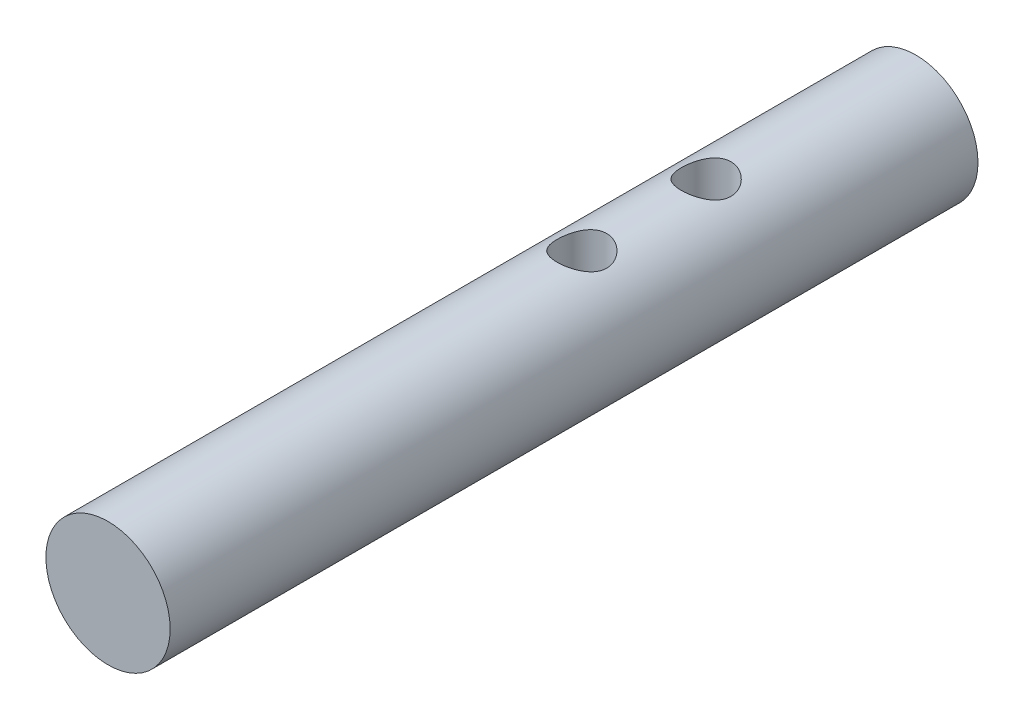
ISO-10303-21;
HEADER;
FILE_DESCRIPTION(('STEP AP214'),'2;1');
FILE_NAME('part.step','',(''),(''),'','','');
FILE_SCHEMA(('AUTOMOTIVE_DESIGN { 1 0 10303 214 1 1 1 1 }'));
ENDSEC;
DATA;
#1=APPLICATION_CONTEXT('core data for automotive mechanical design processes');
#2=APPLICATION_PROTOCOL_DEFINITION('international standard','automotive_design',2000,#1);
#3=PRODUCT_CONTEXT('',#1,'mechanical');
#4=PRODUCT('Part','Part','',(#3));
#5=PRODUCT_RELATED_PRODUCT_CATEGORY('part','',(#4));
#6=PRODUCT_DEFINITION_FORMATION('','',#4);
#7=PRODUCT_DEFINITION_CONTEXT('part definition',#1,'design');
#8=PRODUCT_DEFINITION('design','',#6,#7);
#9=PRODUCT_DEFINITION_SHAPE('','',#8);
#10=(LENGTH_UNIT() NAMED_UNIT(*) SI_UNIT(.MILLI.,.METRE.));
#11=(NAMED_UNIT(*) PLANE_ANGLE_UNIT() SI_UNIT($,.RADIAN.));
#12=(NAMED_UNIT(*) SI_UNIT($,.STERADIAN.) SOLID_ANGLE_UNIT());
#13=UNCERTAINTY_MEASURE_WITH_UNIT(LENGTH_MEASURE(1.E-05),#10,'distance_accuracy_value','');
#14=(GEOMETRIC_REPRESENTATION_CONTEXT(3) GLOBAL_UNCERTAINTY_ASSIGNED_CONTEXT((#13)) GLOBAL_UNIT_ASSIGNED_CONTEXT((#10,
#11,#12)) REPRESENTATION_CONTEXT('',''));
#15=CARTESIAN_POINT('',(0.,0.,0.));
#16=DIRECTION('',(0.,0.,1.));
#17=DIRECTION('',(1.,0.,0.));
#18=AXIS2_PLACEMENT_3D('',#15,#16,#17);
#19=CARTESIAN_POINT('',(0.,0.,52.));
#20=DIRECTION('',(0.,0.,-1.));
#21=DIRECTION('',(-1.,0.,0.));
#22=AXIS2_PLACEMENT_3D('',#19,#20,#21);
#23=CYLINDRICAL_SURFACE('',#22,4.);
#24=CARTESIAN_POINT('',(0.,-4.,15.1));
#25=CARTESIAN_POINT('',(0.085994404354313,-3.99999416981668,15.099992118541));
#26=CARTESIAN_POINT('',(0.172138051272538,-3.99719435445546,15.0930257983293));
#27=CARTESIAN_POINT('',(0.341997184334316,-3.98626762480513,15.065401837183));
#28=CARTESIAN_POINT('',(0.425705422048998,-3.97812622959102,15.0447069767311));
#29=CARTESIAN_POINT('',(0.587963138181922,-3.95739367370495,14.9904991375529));
#30=CARTESIAN_POINT('',(0.666528529293566,-3.94481709091258,14.9570281230266));
#31=CARTESIAN_POINT('',(0.816857576262693,-3.91645288636863,14.8783846613388));
#32=CARTESIAN_POINT('',(0.888623581400793,-3.90066637966445,14.8332162760649));
#33=CARTESIAN_POINT('',(1.02680080605631,-3.86664708936335,14.7302116011513));
#34=CARTESIAN_POINT('',(1.09284981804017,-3.84833837543352,14.6719146750078));
#35=CARTESIAN_POINT('',(1.21454000382778,-3.81168461524956,14.5452799972186));
#36=CARTESIAN_POINT('',(1.27017608570683,-3.79333955563034,14.4769373622306));
#37=CARTESIAN_POINT('',(1.3718996538343,-3.75778233437709,14.3284575438062));
#38=CARTESIAN_POINT('',(1.41745198495638,-3.74065692771961,14.2479308111814));
#39=CARTESIAN_POINT('',(1.49420377522972,-3.71066917749434,14.079570881264));
#40=CARTESIAN_POINT('',(1.52541005142867,-3.69780480995341,13.9917411777213));
#41=CARTESIAN_POINT('',(1.57111905871669,-3.67861086128655,13.8154301331263));
#42=CARTESIAN_POINT('',(1.58631517264452,-3.67201136284484,13.727159011539));
#43=CARTESIAN_POINT('',(1.60173836931202,-3.66531203239315,13.5490920013542));
#44=CARTESIAN_POINT('',(1.60197281305058,-3.66520900418215,13.4592968843));
#45=CARTESIAN_POINT('',(1.58799149400364,-3.67128400223995,13.2873946628336));
#46=CARTESIAN_POINT('',(1.57478025144411,-3.6770254003076,13.2051874284728));
#47=CARTESIAN_POINT('',(1.53595750423826,-3.69340950086269,13.0442723551946));
#48=CARTESIAN_POINT('',(1.51034383584371,-3.70405305857338,12.9655651295118));
#49=CARTESIAN_POINT('',(1.44695578604086,-3.72927588070824,12.8119857310432));
#50=CARTESIAN_POINT('',(1.40894388985225,-3.7439310342463,12.7372246087562));
#51=CARTESIAN_POINT('',(1.32200516858577,-3.77550493111912,12.5948673469107));
#52=CARTESIAN_POINT('',(1.27307424408067,-3.79242452365479,12.5272739124778));
#53=CARTESIAN_POINT('',(1.16124047956355,-3.82821389393817,12.3956722169584));
#54=CARTESIAN_POINT('',(1.09754997037651,-3.84713331980921,12.3323450164432));
#55=CARTESIAN_POINT('',(0.960251541944155,-3.88367859966626,12.2170524175984));
#56=CARTESIAN_POINT('',(0.886641652267547,-3.9013041955626,12.1650892820718));
#57=CARTESIAN_POINT('',(0.729662122084675,-3.93371745011639,12.0731060420673));
#58=CARTESIAN_POINT('',(0.646128393077184,-3.94844216076332,12.0333421750424));
#59=CARTESIAN_POINT('',(0.472819012386308,-3.97291862663007,11.9686657111376));
#60=CARTESIAN_POINT('',(0.383046557479741,-3.98267290769906,11.9437455699541));
#61=CARTESIAN_POINT('',(0.205516710086258,-3.99564911605528,11.9108413636642));
#62=CARTESIAN_POINT('',(0.11795463518843,-3.99922356666811,11.9019420365972));
#63=CARTESIAN_POINT('',(-0.0574762478462522,-4.00054782808505,11.8986295195771));
#64=CARTESIAN_POINT('',(-0.145344970579138,-3.99829914865833,11.904212574762));
#65=CARTESIAN_POINT('',(-0.314746191297589,-3.98846053651002,11.9290334020416));
#66=CARTESIAN_POINT('',(-0.396385993420379,-3.98111513076419,11.9476463842808));
#67=CARTESIAN_POINT('',(-0.555308342448623,-3.962075531244,11.9971485666478));
#68=CARTESIAN_POINT('',(-0.632590328179875,-3.95038077885224,12.0280393437349));
#69=CARTESIAN_POINT('',(-0.783263028653361,-3.92333275816649,12.102227951744));
#70=CARTESIAN_POINT('',(-0.856462418204324,-3.90787852783843,12.1458763776345));
#71=CARTESIAN_POINT('',(-0.994754872997244,-3.8749869179642,12.2439522591245));
#72=CARTESIAN_POINT('',(-1.0598446726089,-3.85754874488216,12.2983840343381));
#73=CARTESIAN_POINT('',(-1.18457843442306,-3.82116094110489,12.4206960103597));
#74=CARTESIAN_POINT('',(-1.24357914704485,-3.80218753140042,12.489226833205));
#75=CARTESIAN_POINT('',(-1.34940095793097,-3.76593338333706,12.6355520664075));
#76=CARTESIAN_POINT('',(-1.39622004907001,-3.74865292421209,12.713348000272));
#77=CARTESIAN_POINT('',(-1.4766460015453,-3.71771439926167,12.8771693556753));
#78=CARTESIAN_POINT('',(-1.51012047562756,-3.7040930470783,12.9632671993698));
#79=CARTESIAN_POINT('',(-1.56183697576424,-3.68258938782345,13.1405869213721));
#80=CARTESIAN_POINT('',(-1.58009024421545,-3.67470284556799,13.2318049646499));
#81=CARTESIAN_POINT('',(-1.59977249382272,-3.66617407439941,13.4097023214196));
#82=CARTESIAN_POINT('',(-1.60231766584229,-3.66505136806537,13.4962358716747));
#83=CARTESIAN_POINT('',(-1.59344252742202,-3.66891868826478,13.6684358861706));
#84=CARTESIAN_POINT('',(-1.58202399033103,-3.67390793859835,13.7541024591221));
#85=CARTESIAN_POINT('',(-1.54645709292292,-3.68901319263216,13.918665751884));
#86=CARTESIAN_POINT('',(-1.52282999485678,-3.69891865461959,13.9976962195464));
#87=CARTESIAN_POINT('',(-1.46400435879281,-3.72259200986157,14.1507029036908));
#88=CARTESIAN_POINT('',(-1.42880262511505,-3.73636096964805,14.2246777175199));
#89=CARTESIAN_POINT('',(-1.34549821020779,-3.76718887683593,14.3700876954166));
#90=CARTESIAN_POINT('',(-1.29677226812759,-3.78439105850594,14.4411349361044));
#91=CARTESIAN_POINT('',(-1.1887136954172,-3.8197104349779,14.574394653763));
#92=CARTESIAN_POINT('',(-1.1293778678545,-3.83782790438725,14.6366044577027));
#93=CARTESIAN_POINT('',(-0.997204405017971,-3.87434853669915,14.7545622826109));
#94=CARTESIAN_POINT('',(-0.923740800916912,-3.89269406369748,14.8096298455185));
#95=CARTESIAN_POINT('',(-0.767920256228625,-3.92640325370973,14.9066696340973));
#96=CARTESIAN_POINT('',(-0.685559203637791,-3.94176552874325,14.948635769722));
#97=CARTESIAN_POINT('',(-0.515790449996163,-3.96751771852689,15.0172977721522));
#98=CARTESIAN_POINT('',(-0.428505294575758,-3.97799490444022,15.0442634588483));
#99=CARTESIAN_POINT('',(-0.250301237024977,-3.99315444967493,15.0829112967634));
#100=CARTESIAN_POINT('',(-0.159394820687131,-3.9978551959651,15.0946419493951));
#101=CARTESIAN_POINT('',(-0.0455298383127442,-3.99980719603309,15.0995163047826));
#102=CARTESIAN_POINT('',(-0.0227701509926069,-4.00000154375341,15.1000020869034));
#103=CARTESIAN_POINT('',(0.,-4.,15.1));
#104=B_SPLINE_CURVE_WITH_KNOTS('',3,(#24,#25,#26,#27,#28,#29,#30,#31,#32,#33,#34,#35,#36,#37,
#38,#39,#40,#41,#42,#43,#44,#45,#46,#47,#48,#49,#50,#51,#52,#53,#54,#55,#56,#57,#58,#59,#60,#61,
#62,#63,#64,#65,#66,#67,#68,#69,#70,#71,#72,#73,#74,#75,#76,#77,#78,#79,#80,#81,#82,#83,#84,#85,
#86,#87,#88,#89,#90,#91,#92,#93,#94,#95,#96,#97,#98,#99,#100,#101,#102,#103),.UNSPECIFIED.,.T.,
.F.,(4,2,2,2,2,2,2,2,2,2,2,2,2,2,2,2,2,2,2,2,2,2,2,2,2,2,2,2,2,2,2,2,2,2,2,2,2,2,2,4),(0.,
0.257922390314456,0.516546908806347,0.774329165977264,1.03202202854387,1.30077905360318,
1.56966715947529,1.85052207055373,2.13124338494614,2.39923284247063,2.6670904507239,
2.91630662721098,3.16556629804838,3.41991301039053,3.67435537550547,3.94846679349246,
4.22263274271786,4.50221530530245,4.78165564891032,5.04455347622406,5.30738314856066,
5.55840364451493,5.80945639195037,6.0681881071861,6.32702367599175,6.60294779699531,
6.87891735234999,7.15756036112662,7.43599738116747,7.69439738714199,7.95276458050437,
8.20091454839015,8.44913308644129,8.71156374445354,8.97407361078715,9.25360338827069,
9.53326290912427,9.80771440810656,10.0812900192347,10.1495843671744),.UNSPECIFIED.);
#105=CARTESIAN_POINT('',(0.,-4.,15.1));
#106=VERTEX_POINT('',#105);
#107=EDGE_CURVE('E10',#106,#106,#104,.T.);
#108=ORIENTED_EDGE('',*,*,#107,.T.);
#109=EDGE_LOOP('',(#108));
#110=FACE_BOUND('',#109,.T.);
#111=CARTESIAN_POINT('',(0.,4.,15.1));
#112=CARTESIAN_POINT('',(-0.085994404354313,3.99999416981667,15.099992118541));
#113=CARTESIAN_POINT('',(-0.172138051272539,3.99719435445546,15.0930257983293));
#114=CARTESIAN_POINT('',(-0.341997184334316,3.98626762480513,15.065401837183));
#115=CARTESIAN_POINT('',(-0.425705422048998,3.97812622959102,15.0447069767311));
#116=CARTESIAN_POINT('',(-0.587963138181922,3.95739367370495,14.9904991375529));
#117=CARTESIAN_POINT('',(-0.666528529293567,3.94481709091258,14.9570281230266));
#118=CARTESIAN_POINT('',(-0.816857576262694,3.91645288636862,14.8783846613388));
#119=CARTESIAN_POINT('',(-0.888623581400793,3.90066637966445,14.8332162760649));
#120=CARTESIAN_POINT('',(-1.02680080605631,3.86664708936335,14.7302116011513));
#121=CARTESIAN_POINT('',(-1.09284981804017,3.84833837543352,14.6719146750078));
#122=CARTESIAN_POINT('',(-1.21454000382778,3.81168461524956,14.5452799972186));
#123=CARTESIAN_POINT('',(-1.27017608570683,3.79333955563034,14.4769373622306));
#124=CARTESIAN_POINT('',(-1.3718996538343,3.75778233437709,14.3284575438062));
#125=CARTESIAN_POINT('',(-1.41745198495638,3.74065692771961,14.2479308111814));
#126=CARTESIAN_POINT('',(-1.49420377522972,3.71066917749434,14.079570881264));
#127=CARTESIAN_POINT('',(-1.52541005142867,3.69780480995341,13.9917411777213));
#128=CARTESIAN_POINT('',(-1.57111905871669,3.67861086128655,13.8154301331263));
#129=CARTESIAN_POINT('',(-1.58631517264452,3.67201136284484,13.727159011539));
#130=CARTESIAN_POINT('',(-1.60173836931202,3.66531203239315,13.5490920013542));
#131=CARTESIAN_POINT('',(-1.60197281305058,3.66520900418215,13.4592968843));
#132=CARTESIAN_POINT('',(-1.58799149400364,3.67128400223995,13.2873946628336));
#133=CARTESIAN_POINT('',(-1.57478025144411,3.6770254003076,13.2051874284728));
#134=CARTESIAN_POINT('',(-1.53595750423826,3.69340950086269,13.0442723551946));
#135=CARTESIAN_POINT('',(-1.51034383584371,3.70405305857338,12.9655651295118));
#136=CARTESIAN_POINT('',(-1.44695578604086,3.72927588070824,12.8119857310432));
#137=CARTESIAN_POINT('',(-1.40894388985225,3.7439310342463,12.7372246087562));
#138=CARTESIAN_POINT('',(-1.32200516858577,3.77550493111912,12.5948673469107));
#139=CARTESIAN_POINT('',(-1.27307424408067,3.79242452365479,12.5272739124778));
#140=CARTESIAN_POINT('',(-1.16124047956355,3.82821389393817,12.3956722169584));
#141=CARTESIAN_POINT('',(-1.09754997037651,3.84713331980921,12.3323450164432));
#142=CARTESIAN_POINT('',(-0.960251541944155,3.88367859966626,12.2170524175984));
#143=CARTESIAN_POINT('',(-0.886641652267548,3.9013041955626,12.1650892820718));
#144=CARTESIAN_POINT('',(-0.729662122084675,3.93371745011639,12.0731060420673));
#145=CARTESIAN_POINT('',(-0.646128393077183,3.94844216076332,12.0333421750424));
#146=CARTESIAN_POINT('',(-0.472819012386307,3.97291862663007,11.9686657111376));
#147=CARTESIAN_POINT('',(-0.38304655747974,3.98267290769906,11.9437455699541));
#148=CARTESIAN_POINT('',(-0.205516710086257,3.99564911605528,11.9108413636642));
#149=CARTESIAN_POINT('',(-0.117954635188429,3.99922356666811,11.9019420365972));
#150=CARTESIAN_POINT('',(0.0574762478462528,4.00054782808505,11.8986295195771));
#151=CARTESIAN_POINT('',(0.145344970579138,3.99829914865833,11.904212574762));
#152=CARTESIAN_POINT('',(0.314746191297589,3.98846053651002,11.9290334020416));
#153=CARTESIAN_POINT('',(0.396385993420379,3.98111513076419,11.9476463842808));
#154=CARTESIAN_POINT('',(0.555308342448624,3.962075531244,11.9971485666478));
#155=CARTESIAN_POINT('',(0.632590328179875,3.95038077885224,12.0280393437349));
#156=CARTESIAN_POINT('',(0.783263028653362,3.92333275816649,12.102227951744));
#157=CARTESIAN_POINT('',(0.856462418204325,3.90787852783843,12.1458763776345));
#158=CARTESIAN_POINT('',(0.994754872997244,3.8749869179642,12.2439522591245));
#159=CARTESIAN_POINT('',(1.0598446726089,3.85754874488216,12.2983840343381));
#160=CARTESIAN_POINT('',(1.18457843442305,3.82116094110489,12.4206960103597));
#161=CARTESIAN_POINT('',(1.24357914704485,3.80218753140042,12.489226833205));
#162=CARTESIAN_POINT('',(1.34940095793097,3.76593338333706,12.6355520664075));
#163=CARTESIAN_POINT('',(1.39622004907001,3.74865292421209,12.713348000272));
#164=CARTESIAN_POINT('',(1.4766460015453,3.71771439926167,12.8771693556753));
#165=CARTESIAN_POINT('',(1.51012047562756,3.7040930470783,12.9632671993698));
#166=CARTESIAN_POINT('',(1.56183697576424,3.68258938782345,13.1405869213721));
#167=CARTESIAN_POINT('',(1.58009024421545,3.67470284556799,13.2318049646499));
#168=CARTESIAN_POINT('',(1.59977249382272,3.66617407439941,13.4097023214196));
#169=CARTESIAN_POINT('',(1.60231766584229,3.66505136806537,13.4962358716747));
#170=CARTESIAN_POINT('',(1.59344252742202,3.66891868826478,13.6684358861706));
#171=CARTESIAN_POINT('',(1.58202399033103,3.67390793859835,13.7541024591221));
#172=CARTESIAN_POINT('',(1.54645709292292,3.68901319263216,13.918665751884));
#173=CARTESIAN_POINT('',(1.52282999485678,3.69891865461959,13.9976962195464));
#174=CARTESIAN_POINT('',(1.46400435879281,3.72259200986157,14.1507029036908));
#175=CARTESIAN_POINT('',(1.42880262511505,3.73636096964805,14.2246777175199));
#176=CARTESIAN_POINT('',(1.34549821020779,3.76718887683593,14.3700876954166));
#177=CARTESIAN_POINT('',(1.29677226812759,3.78439105850594,14.4411349361044));
#178=CARTESIAN_POINT('',(1.1887136954172,3.8197104349779,14.574394653763));
#179=CARTESIAN_POINT('',(1.1293778678545,3.83782790438725,14.6366044577027));
#180=CARTESIAN_POINT('',(0.997204405017971,3.87434853669915,14.7545622826109));
#181=CARTESIAN_POINT('',(0.923740800916911,3.89269406369748,14.8096298455185));
#182=CARTESIAN_POINT('',(0.767920256228623,3.92640325370973,14.9066696340973));
#183=CARTESIAN_POINT('',(0.685559203637791,3.94176552874325,14.948635769722));
#184=CARTESIAN_POINT('',(0.515790449996163,3.96751771852689,15.0172977721522));
#185=CARTESIAN_POINT('',(0.428505294575758,3.97799490444022,15.0442634588483));
#186=CARTESIAN_POINT('',(0.250301237024977,3.99315444967493,15.0829112967634));
#187=CARTESIAN_POINT('',(0.159394820687131,3.9978551959651,15.0946419493951));
#188=CARTESIAN_POINT('',(0.0455298383127443,3.99980719603309,15.0995163047826));
#189=CARTESIAN_POINT('',(0.022770150992607,4.00000154375341,15.1000020869034));
#190=CARTESIAN_POINT('',(0.,4.,15.1));
#191=B_SPLINE_CURVE_WITH_KNOTS('',3,(#111,#112,#113,#114,#115,#116,#117,#118,#119,#120,#121,
#122,#123,#124,#125,#126,#127,#128,#129,#130,#131,#132,#133,#134,#135,#136,#137,#138,#139,#140,
#141,#142,#143,#144,#145,#146,#147,#148,#149,#150,#151,#152,#153,#154,#155,#156,#157,#158,#159,
#160,#161,#162,#163,#164,#165,#166,#167,#168,#169,#170,#171,#172,#173,#174,#175,#176,#177,#178,
#179,#180,#181,#182,#183,#184,#185,#186,#187,#188,#189,#190),.UNSPECIFIED.,.T.,.F.,(4,2,2,2,2,2,
2,2,2,2,2,2,2,2,2,2,2,2,2,2,2,2,2,2,2,2,2,2,2,2,2,2,2,2,2,2,2,2,2,4),(0.,0.257922390314457,
0.516546908806347,0.774329165977265,1.03202202854387,1.30077905360318,1.56966715947529,
1.85052207055373,2.13124338494614,2.39923284247063,2.6670904507239,2.91630662721098,
3.16556629804838,3.41991301039053,3.67435537550547,3.94846679349246,4.22263274271786,
4.50221530530245,4.78165564891032,5.04455347622406,5.30738314856066,5.55840364451493,
5.80945639195037,6.0681881071861,6.32702367599175,6.60294779699531,6.87891735234999,
7.15756036112662,7.43599738116747,7.69439738714199,7.95276458050437,8.20091454839015,
8.44913308644129,8.71156374445354,8.97407361078715,9.25360338827069,9.53326290912427,
9.80771440810655,10.0812900192347,10.1495843671744),.UNSPECIFIED.);
#192=CARTESIAN_POINT('',(0.,4.,15.1));
#193=VERTEX_POINT('',#192);
#194=EDGE_CURVE('E41',#193,#193,#191,.T.);
#195=ORIENTED_EDGE('',*,*,#194,.T.);
#196=EDGE_LOOP('',(#195));
#197=FACE_BOUND('',#196,.T.);
#198=CARTESIAN_POINT('',(0.,-4.,23.1));
#199=CARTESIAN_POINT('',(0.0859944043543127,-3.99999416981668,23.099992118541));
#200=CARTESIAN_POINT('',(0.172138051272538,-3.99719435445546,23.0930257983293));
#201=CARTESIAN_POINT('',(0.341997184334316,-3.98626762480513,23.065401837183));
#202=CARTESIAN_POINT('',(0.425705422048998,-3.97812622959102,23.0447069767311));
#203=CARTESIAN_POINT('',(0.587963138181922,-3.95739367370495,22.9904991375529));
#204=CARTESIAN_POINT('',(0.666528529293567,-3.94481709091258,22.9570281230266));
#205=CARTESIAN_POINT('',(0.816857576262694,-3.91645288636862,22.8783846613388));
#206=CARTESIAN_POINT('',(0.888623581400793,-3.90066637966445,22.8332162760649));
#207=CARTESIAN_POINT('',(1.02680080605631,-3.86664708936335,22.7302116011513));
#208=CARTESIAN_POINT('',(1.09284981804017,-3.84833837543352,22.6719146750078));
#209=CARTESIAN_POINT('',(1.21454000382778,-3.81168461524956,22.5452799972186));
#210=CARTESIAN_POINT('',(1.27017608570683,-3.79333955563034,22.4769373622306));
#211=CARTESIAN_POINT('',(1.3718996538343,-3.75778233437709,22.3284575438062));
#212=CARTESIAN_POINT('',(1.41745198495638,-3.74065692771961,22.2479308111814));
#213=CARTESIAN_POINT('',(1.49420377522972,-3.71066917749434,22.079570881264));
#214=CARTESIAN_POINT('',(1.52541005142867,-3.69780480995341,21.9917411777213));
#215=CARTESIAN_POINT('',(1.57111905871669,-3.67861086128655,21.8154301331263));
#216=CARTESIAN_POINT('',(1.58631517264452,-3.67201136284484,21.727159011539));
#217=CARTESIAN_POINT('',(1.60173836931202,-3.66531203239315,21.5490920013542));
#218=CARTESIAN_POINT('',(1.60197281305058,-3.66520900418215,21.4592968843));
#219=CARTESIAN_POINT('',(1.58799149400364,-3.67128400223995,21.2873946628336));
#220=CARTESIAN_POINT('',(1.57478025144411,-3.6770254003076,21.2051874284728));
#221=CARTESIAN_POINT('',(1.53595750423826,-3.69340950086269,21.0442723551946));
#222=CARTESIAN_POINT('',(1.51034383584371,-3.70405305857338,20.9655651295118));
#223=CARTESIAN_POINT('',(1.44695578604086,-3.72927588070824,20.8119857310432));
#224=CARTESIAN_POINT('',(1.40894388985225,-3.7439310342463,20.7372246087562));
#225=CARTESIAN_POINT('',(1.32200516858577,-3.77550493111912,20.5948673469107));
#226=CARTESIAN_POINT('',(1.27307424408068,-3.79242452365479,20.5272739124778));
#227=CARTESIAN_POINT('',(1.16124047956355,-3.82821389393817,20.3956722169584));
#228=CARTESIAN_POINT('',(1.09754997037651,-3.84713331980921,20.3323450164432));
#229=CARTESIAN_POINT('',(0.960251541944155,-3.88367859966626,20.2170524175984));
#230=CARTESIAN_POINT('',(0.886641652267549,-3.9013041955626,20.1650892820718));
#231=CARTESIAN_POINT('',(0.729662122084677,-3.93371745011639,20.0731060420673));
#232=CARTESIAN_POINT('',(0.646128393077185,-3.94844216076332,20.0333421750424));
#233=CARTESIAN_POINT('',(0.472819012386308,-3.97291862663007,19.9686657111376));
#234=CARTESIAN_POINT('',(0.383046557479741,-3.98267290769906,19.9437455699541));
#235=CARTESIAN_POINT('',(0.205516710086258,-3.99564911605528,19.9108413636642));
#236=CARTESIAN_POINT('',(0.117954635188429,-3.99922356666811,19.9019420365971));
#237=CARTESIAN_POINT('',(-0.0574762478462527,-4.00054782808505,19.8986295195771));
#238=CARTESIAN_POINT('',(-0.145344970579138,-3.99829914865833,19.904212574762));
#239=CARTESIAN_POINT('',(-0.31474619129759,-3.98846053651002,19.9290334020416));
#240=CARTESIAN_POINT('',(-0.39638599342038,-3.98111513076419,19.9476463842808));
#241=CARTESIAN_POINT('',(-0.555308342448625,-3.962075531244,19.9971485666478));
#242=CARTESIAN_POINT('',(-0.632590328179876,-3.95038077885224,20.0280393437349));
#243=CARTESIAN_POINT('',(-0.783263028653362,-3.92333275816649,20.102227951744));
#244=CARTESIAN_POINT('',(-0.856462418204326,-3.90787852783843,20.1458763776345));
#245=CARTESIAN_POINT('',(-0.994754872997246,-3.8749869179642,20.2439522591245));
#246=CARTESIAN_POINT('',(-1.0598446726089,-3.85754874488216,20.2983840343381));
#247=CARTESIAN_POINT('',(-1.18457843442306,-3.82116094110489,20.4206960103597));
#248=CARTESIAN_POINT('',(-1.24357914704485,-3.80218753140041,20.489226833205));
#249=CARTESIAN_POINT('',(-1.34940095793097,-3.76593338333706,20.6355520664075));
#250=CARTESIAN_POINT('',(-1.39622004907001,-3.74865292421209,20.713348000272));
#251=CARTESIAN_POINT('',(-1.4766460015453,-3.71771439926167,20.8771693556753));
#252=CARTESIAN_POINT('',(-1.51012047562756,-3.7040930470783,20.9632671993698));
#253=CARTESIAN_POINT('',(-1.56183697576424,-3.68258938782345,21.1405869213721));
#254=CARTESIAN_POINT('',(-1.58009024421545,-3.67470284556799,21.2318049646499));
#255=CARTESIAN_POINT('',(-1.59977249382272,-3.66617407439941,21.4097023214196));
#256=CARTESIAN_POINT('',(-1.60231766584229,-3.66505136806537,21.4962358716747));
#257=CARTESIAN_POINT('',(-1.59344252742202,-3.66891868826478,21.6684358861706));
#258=CARTESIAN_POINT('',(-1.58202399033103,-3.67390793859835,21.7541024591221));
#259=CARTESIAN_POINT('',(-1.54645709292292,-3.68901319263216,21.918665751884));
#260=CARTESIAN_POINT('',(-1.52282999485678,-3.6989186546196,21.9976962195464));
#261=CARTESIAN_POINT('',(-1.46400435879281,-3.72259200986157,22.1507029036908));
#262=CARTESIAN_POINT('',(-1.42880262511505,-3.73636096964805,22.2246777175199));
#263=CARTESIAN_POINT('',(-1.34549821020779,-3.76718887683593,22.3700876954166));
#264=CARTESIAN_POINT('',(-1.29677226812759,-3.78439105850594,22.4411349361044));
#265=CARTESIAN_POINT('',(-1.1887136954172,-3.8197104349779,22.574394653763));
#266=CARTESIAN_POINT('',(-1.1293778678545,-3.83782790438725,22.6366044577026));
#267=CARTESIAN_POINT('',(-0.997204405017971,-3.87434853669915,22.7545622826109));
#268=CARTESIAN_POINT('',(-0.923740800916912,-3.89269406369748,22.8096298455185));
#269=CARTESIAN_POINT('',(-0.767920256228625,-3.92640325370973,22.9066696340973));
#270=CARTESIAN_POINT('',(-0.685559203637791,-3.94176552874325,22.948635769722));
#271=CARTESIAN_POINT('',(-0.515790449996162,-3.96751771852689,23.0172977721522));
#272=CARTESIAN_POINT('',(-0.428505294575757,-3.97799490444022,23.0442634588483));
#273=CARTESIAN_POINT('',(-0.250301237024976,-3.99315444967493,23.0829112967634));
#274=CARTESIAN_POINT('',(-0.159394820687128,-3.9978551959651,23.0946419493951));
#275=CARTESIAN_POINT('',(-0.045529838312742,-3.99980719603309,23.0995163047826));
#276=CARTESIAN_POINT('',(-0.0227701509926059,-4.00000154375341,23.1000020869034));
#277=CARTESIAN_POINT('',(0.,-4.,23.1));
#278=B_SPLINE_CURVE_WITH_KNOTS('',3,(#198,#199,#200,#201,#202,#203,#204,#205,#206,#207,#208,
#209,#210,#211,#212,#213,#214,#215,#216,#217,#218,#219,#220,#221,#222,#223,#224,#225,#226,#227,
#228,#229,#230,#231,#232,#233,#234,#235,#236,#237,#238,#239,#240,#241,#242,#243,#244,#245,#246,
#247,#248,#249,#250,#251,#252,#253,#254,#255,#256,#257,#258,#259,#260,#261,#262,#263,#264,#265,
#266,#267,#268,#269,#270,#271,#272,#273,#274,#275,#276,#277),.UNSPECIFIED.,.T.,.F.,(4,2,2,2,2,2,
2,2,2,2,2,2,2,2,2,2,2,2,2,2,2,2,2,2,2,2,2,2,2,2,2,2,2,2,2,2,2,2,2,4),(0.,0.257922390314456,
0.516546908806347,0.774329165977266,1.03202202854387,1.30077905360317,1.56966715947529,
1.85052207055374,2.13124338494614,2.39923284247063,2.6670904507239,2.91630662721098,
3.16556629804838,3.41991301039053,3.67435537550547,3.94846679349246,4.22263274271786,
4.50221530530245,4.78165564891032,5.04455347622406,5.30738314856066,5.55840364451493,
5.80945639195037,6.0681881071861,6.32702367599175,6.60294779699531,6.87891735234998,
7.15756036112662,7.43599738116747,7.69439738714199,7.95276458050437,8.20091454839016,
8.44913308644129,8.71156374445354,8.97407361078715,9.25360338827069,9.53326290912426,
9.80771440810655,10.0812900192347,10.1495843671744),.UNSPECIFIED.);
#279=CARTESIAN_POINT('',(0.,-4.,23.1));
#280=VERTEX_POINT('',#279);
#281=EDGE_CURVE('E45',#280,#280,#278,.T.);
#282=ORIENTED_EDGE('',*,*,#281,.T.);
#283=EDGE_LOOP('',(#282));
#284=FACE_BOUND('',#283,.T.);
#285=CARTESIAN_POINT('',(0.,4.,23.1));
#286=CARTESIAN_POINT('',(-0.0859944043543128,3.99999416981667,23.099992118541));
#287=CARTESIAN_POINT('',(-0.172138051272538,3.99719435445546,23.0930257983293));
#288=CARTESIAN_POINT('',(-0.341997184334316,3.98626762480513,23.065401837183));
#289=CARTESIAN_POINT('',(-0.425705422048998,3.97812622959102,23.0447069767311));
#290=CARTESIAN_POINT('',(-0.587963138181923,3.95739367370495,22.9904991375529));
#291=CARTESIAN_POINT('',(-0.666528529293567,3.94481709091258,22.9570281230266));
#292=CARTESIAN_POINT('',(-0.816857576262694,3.91645288636862,22.8783846613388));
#293=CARTESIAN_POINT('',(-0.888623581400794,3.90066637966445,22.8332162760649));
#294=CARTESIAN_POINT('',(-1.02680080605631,3.86664708936335,22.7302116011513));
#295=CARTESIAN_POINT('',(-1.09284981804017,3.84833837543352,22.6719146750078));
#296=CARTESIAN_POINT('',(-1.21454000382778,3.81168461524956,22.5452799972186));
#297=CARTESIAN_POINT('',(-1.27017608570683,3.79333955563034,22.4769373622306));
#298=CARTESIAN_POINT('',(-1.3718996538343,3.75778233437709,22.3284575438062));
#299=CARTESIAN_POINT('',(-1.41745198495638,3.74065692771961,22.2479308111814));
#300=CARTESIAN_POINT('',(-1.49420377522972,3.71066917749434,22.079570881264));
#301=CARTESIAN_POINT('',(-1.52541005142867,3.69780480995341,21.9917411777213));
#302=CARTESIAN_POINT('',(-1.57111905871669,3.67861086128655,21.8154301331263));
#303=CARTESIAN_POINT('',(-1.58631517264452,3.67201136284484,21.727159011539));
#304=CARTESIAN_POINT('',(-1.60173836931202,3.66531203239315,21.5490920013542));
#305=CARTESIAN_POINT('',(-1.60197281305058,3.66520900418215,21.4592968843));
#306=CARTESIAN_POINT('',(-1.58799149400364,3.67128400223995,21.2873946628336));
#307=CARTESIAN_POINT('',(-1.57478025144411,3.6770254003076,21.2051874284728));
#308=CARTESIAN_POINT('',(-1.53595750423826,3.69340950086269,21.0442723551946));
#309=CARTESIAN_POINT('',(-1.51034383584371,3.70405305857338,20.9655651295118));
#310=CARTESIAN_POINT('',(-1.44695578604086,3.72927588070824,20.8119857310432));
#311=CARTESIAN_POINT('',(-1.40894388985225,3.7439310342463,20.7372246087562));
#312=CARTESIAN_POINT('',(-1.32200516858577,3.77550493111912,20.5948673469107));
#313=CARTESIAN_POINT('',(-1.27307424408068,3.79242452365479,20.5272739124778));
#314=CARTESIAN_POINT('',(-1.16124047956355,3.82821389393817,20.3956722169584));
#315=CARTESIAN_POINT('',(-1.09754997037651,3.84713331980921,20.3323450164432));
#316=CARTESIAN_POINT('',(-0.960251541944153,3.88367859966626,20.2170524175984));
#317=CARTESIAN_POINT('',(-0.886641652267546,3.9013041955626,20.1650892820718));
#318=CARTESIAN_POINT('',(-0.729662122084673,3.93371745011639,20.0731060420673));
#319=CARTESIAN_POINT('',(-0.64612839307718,3.94844216076332,20.0333421750424));
#320=CARTESIAN_POINT('',(-0.472819012386305,3.97291862663007,19.9686657111376));
#321=CARTESIAN_POINT('',(-0.383046557479739,3.98267290769906,19.9437455699541));
#322=CARTESIAN_POINT('',(-0.205516710086256,3.99564911605528,19.9108413636642));
#323=CARTESIAN_POINT('',(-0.117954635188428,3.99922356666811,19.9019420365971));
#324=CARTESIAN_POINT('',(0.0574762478462537,4.00054782808505,19.8986295195771));
#325=CARTESIAN_POINT('',(0.145344970579139,3.99829914865833,19.904212574762));
#326=CARTESIAN_POINT('',(0.31474619129759,3.98846053651002,19.9290334020416));
#327=CARTESIAN_POINT('',(0.39638599342038,3.98111513076419,19.9476463842808));
#328=CARTESIAN_POINT('',(0.555308342448625,3.962075531244,19.9971485666478));
#329=CARTESIAN_POINT('',(0.632590328179876,3.95038077885224,20.0280393437349));
#330=CARTESIAN_POINT('',(0.783263028653363,3.92333275816649,20.102227951744));
#331=CARTESIAN_POINT('',(0.856462418204326,3.90787852783843,20.1458763776345));
#332=CARTESIAN_POINT('',(0.994754872997246,3.8749869179642,20.2439522591245));
#333=CARTESIAN_POINT('',(1.0598446726089,3.85754874488216,20.2983840343381));
#334=CARTESIAN_POINT('',(1.18457843442306,3.82116094110489,20.4206960103597));
#335=CARTESIAN_POINT('',(1.24357914704485,3.80218753140041,20.489226833205));
#336=CARTESIAN_POINT('',(1.34940095793097,3.76593338333706,20.6355520664075));
#337=CARTESIAN_POINT('',(1.39622004907001,3.74865292421209,20.713348000272));
#338=CARTESIAN_POINT('',(1.4766460015453,3.71771439926167,20.8771693556753));
#339=CARTESIAN_POINT('',(1.51012047562756,3.7040930470783,20.9632671993698));
#340=CARTESIAN_POINT('',(1.56183697576424,3.68258938782345,21.1405869213721));
#341=CARTESIAN_POINT('',(1.58009024421545,3.67470284556799,21.2318049646499));
#342=CARTESIAN_POINT('',(1.59977249382272,3.66617407439941,21.4097023214196));
#343=CARTESIAN_POINT('',(1.60231766584229,3.66505136806537,21.4962358716747));
#344=CARTESIAN_POINT('',(1.59344252742202,3.66891868826478,21.6684358861706));
#345=CARTESIAN_POINT('',(1.58202399033103,3.67390793859835,21.7541024591221));
#346=CARTESIAN_POINT('',(1.54645709292292,3.68901319263216,21.918665751884));
#347=CARTESIAN_POINT('',(1.52282999485678,3.6989186546196,21.9976962195464));
#348=CARTESIAN_POINT('',(1.46400435879281,3.72259200986157,22.1507029036908));
#349=CARTESIAN_POINT('',(1.42880262511505,3.73636096964805,22.2246777175199));
#350=CARTESIAN_POINT('',(1.34549821020779,3.76718887683593,22.3700876954166));
#351=CARTESIAN_POINT('',(1.29677226812759,3.78439105850594,22.4411349361044));
#352=CARTESIAN_POINT('',(1.1887136954172,3.8197104349779,22.574394653763));
#353=CARTESIAN_POINT('',(1.1293778678545,3.83782790438725,22.6366044577026));
#354=CARTESIAN_POINT('',(0.997204405017971,3.87434853669915,22.7545622826109));
#355=CARTESIAN_POINT('',(0.923740800916912,3.89269406369748,22.8096298455185));
#356=CARTESIAN_POINT('',(0.767920256228625,3.92640325370973,22.9066696340973));
#357=CARTESIAN_POINT('',(0.685559203637791,3.94176552874325,22.948635769722));
#358=CARTESIAN_POINT('',(0.515790449996162,3.96751771852689,23.0172977721522));
#359=CARTESIAN_POINT('',(0.428505294575757,3.97799490444022,23.0442634588483));
#360=CARTESIAN_POINT('',(0.250301237024976,3.99315444967493,23.0829112967634));
#361=CARTESIAN_POINT('',(0.159394820687128,3.9978551959651,23.0946419493951));
#362=CARTESIAN_POINT('',(0.045529838312742,3.99980719603309,23.0995163047826));
#363=CARTESIAN_POINT('',(0.0227701509926059,4.00000154375341,23.1000020869034));
#364=CARTESIAN_POINT('',(0.,4.,23.1));
#365=B_SPLINE_CURVE_WITH_KNOTS('',3,(#285,#286,#287,#288,#289,#290,#291,#292,#293,#294,#295,
#296,#297,#298,#299,#300,#301,#302,#303,#304,#305,#306,#307,#308,#309,#310,#311,#312,#313,#314,
#315,#316,#317,#318,#319,#320,#321,#322,#323,#324,#325,#326,#327,#328,#329,#330,#331,#332,#333,
#334,#335,#336,#337,#338,#339,#340,#341,#342,#343,#344,#345,#346,#347,#348,#349,#350,#351,#352,
#353,#354,#355,#356,#357,#358,#359,#360,#361,#362,#363,#364),.UNSPECIFIED.,.T.,.F.,(4,2,2,2,2,2,
2,2,2,2,2,2,2,2,2,2,2,2,2,2,2,2,2,2,2,2,2,2,2,2,2,2,2,2,2,2,2,2,2,4),(0.,0.257922390314456,
0.516546908806348,0.774329165977266,1.03202202854387,1.30077905360317,1.56966715947529,
1.85052207055374,2.13124338494614,2.39923284247062,2.66709045072391,2.91630662721098,
3.16556629804838,3.41991301039053,3.67435537550547,3.94846679349246,4.22263274271786,
4.50221530530245,4.78165564891032,5.04455347622406,5.30738314856066,5.55840364451493,
5.80945639195037,6.0681881071861,6.32702367599175,6.60294779699531,6.87891735234998,
7.15756036112662,7.43599738116747,7.69439738714199,7.95276458050437,8.20091454839016,
8.44913308644129,8.71156374445354,8.97407361078715,9.25360338827069,9.53326290912426,
9.80771440810655,10.0812900192347,10.1495843671744),.UNSPECIFIED.);
#366=CARTESIAN_POINT('',(0.,4.,23.1));
#367=VERTEX_POINT('',#366);
#368=EDGE_CURVE('E49',#367,#367,#365,.T.);
#369=ORIENTED_EDGE('',*,*,#368,.T.);
#370=EDGE_LOOP('',(#369));
#371=FACE_BOUND('',#370,.T.);
#372=CARTESIAN_POINT('',(0.,0.,52.));
#373=DIRECTION('',(0.,0.,1.));
#374=DIRECTION('',(1.,0.,0.));
#375=AXIS2_PLACEMENT_3D('',#372,#373,#374);
#376=CIRCLE('',#375,4.);
#377=CARTESIAN_POINT('',(4.,0.,52.));
#378=VERTEX_POINT('',#377);
#379=EDGE_CURVE('E74',#378,#378,#376,.T.);
#380=ORIENTED_EDGE('',*,*,#379,.F.);
#381=EDGE_LOOP('',(#380));
#382=FACE_BOUND('',#381,.T.);
#383=CARTESIAN_POINT('',(0.,0.,0.));
#384=DIRECTION('',(0.,0.,1.));
#385=DIRECTION('',(1.,0.,0.));
#386=AXIS2_PLACEMENT_3D('',#383,#384,#385);
#387=CIRCLE('',#386,4.);
#388=CARTESIAN_POINT('',(4.,0.,0.));
#389=VERTEX_POINT('',#388);
#390=EDGE_CURVE('E75',#389,#389,#387,.T.);
#391=ORIENTED_EDGE('',*,*,#390,.T.);
#392=EDGE_LOOP('',(#391));
#393=FACE_BOUND('',#392,.T.);
#394=ADVANCED_FACE('F31',(#110,#197,#284,#371,#382,#393),#23,.T.);
#395=CARTESIAN_POINT('',(0.,0.,52.));
#396=DIRECTION('',(0.,0.,1.));
#397=DIRECTION('',(1.,0.,0.));
#398=AXIS2_PLACEMENT_3D('',#395,#396,#397);
#399=PLANE('',#398);
#400=ORIENTED_EDGE('',*,*,#379,.T.);
#401=EDGE_LOOP('',(#400));
#402=FACE_BOUND('',#401,.T.);
#403=ADVANCED_FACE('F68',(#402),#399,.T.);
#404=CARTESIAN_POINT('',(0.,0.,0.));
#405=DIRECTION('',(0.,0.,1.));
#406=DIRECTION('',(1.,0.,0.));
#407=AXIS2_PLACEMENT_3D('',#404,#405,#406);
#408=PLANE('',#407);
#409=ORIENTED_EDGE('',*,*,#390,.F.);
#410=EDGE_LOOP('',(#409));
#411=FACE_BOUND('',#410,.T.);
#412=ADVANCED_FACE('F66',(#411),#408,.F.);
#413=CARTESIAN_POINT('',(0.,-4.,21.5));
#414=DIRECTION('',(0.,1.,0.));
#415=DIRECTION('',(0.,0.,1.));
#416=AXIS2_PLACEMENT_3D('',#413,#414,#415);
#417=CYLINDRICAL_SURFACE('',#416,1.6);
#418=ORIENTED_EDGE('',*,*,#368,.F.);
#419=EDGE_LOOP('',(#418));
#420=FACE_BOUND('',#419,.T.);
#421=ORIENTED_EDGE('',*,*,#281,.F.);
#422=EDGE_LOOP('',(#421));
#423=FACE_BOUND('',#422,.T.);
#424=ADVANCED_FACE('F60',(#420,#423),#417,.F.);
#425=CARTESIAN_POINT('',(0.,-4.,13.5));
#426=DIRECTION('',(0.,1.,0.));
#427=DIRECTION('',(0.,0.,1.));
#428=AXIS2_PLACEMENT_3D('',#425,#426,#427);
#429=CYLINDRICAL_SURFACE('',#428,1.6);
#430=ORIENTED_EDGE('',*,*,#194,.F.);
#431=EDGE_LOOP('',(#430));
#432=FACE_BOUND('',#431,.T.);
#433=ORIENTED_EDGE('',*,*,#107,.F.);
#434=EDGE_LOOP('',(#433));
#435=FACE_BOUND('',#434,.T.);
#436=ADVANCED_FACE('F57',(#432,#435),#429,.F.);
#437=CLOSED_SHELL('',(#394,#403,#412,#424,#436));
#438=MANIFOLD_SOLID_BREP('B2',#437);
#439=ADVANCED_BREP_SHAPE_REPRESENTATION('',(#18,#438),#14);
#440=SHAPE_DEFINITION_REPRESENTATION(#9,#439);
ENDSEC;
END-ISO-10303-21;
